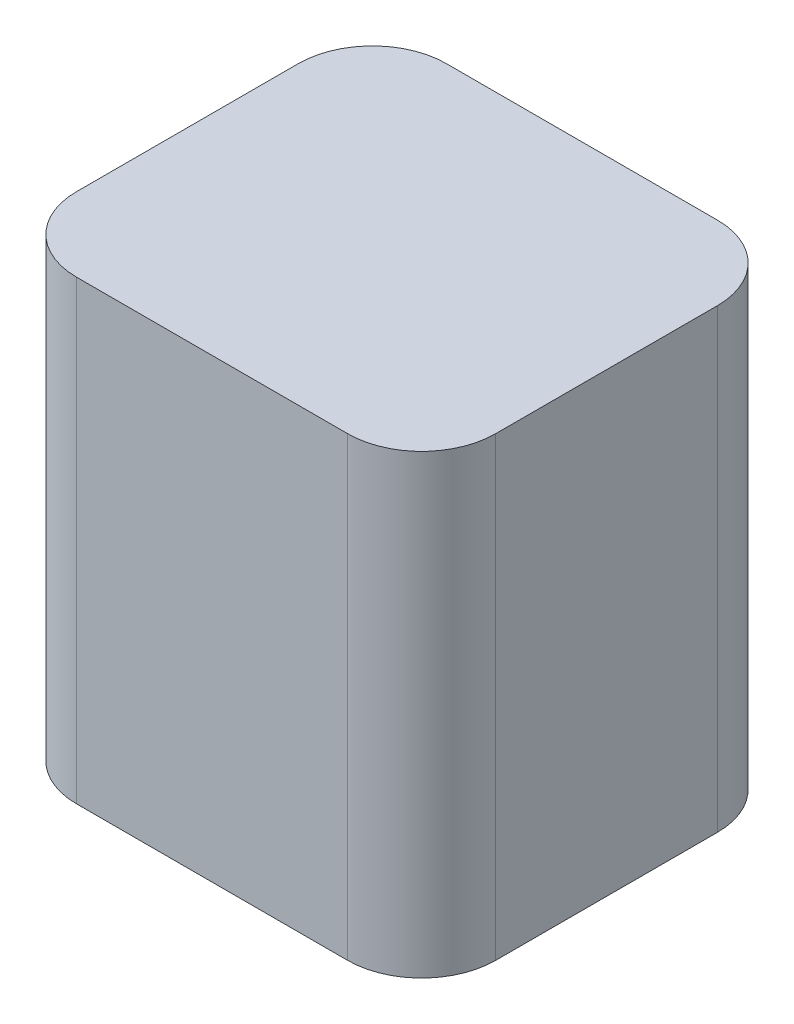
ISO-10303-21;
HEADER;
FILE_DESCRIPTION(('STEP AP214'),'2;1');
FILE_NAME('part.step','',(''),(''),'','','');
FILE_SCHEMA(('AUTOMOTIVE_DESIGN { 1 0 10303 214 1 1 1 1 }'));
ENDSEC;
DATA;
#1=APPLICATION_CONTEXT('core data for automotive mechanical design processes');
#2=APPLICATION_PROTOCOL_DEFINITION('international standard','automotive_design',2000,#1);
#3=PRODUCT_CONTEXT('',#1,'mechanical');
#4=PRODUCT('Part','Part','',(#3));
#5=PRODUCT_RELATED_PRODUCT_CATEGORY('part','',(#4));
#6=PRODUCT_DEFINITION_FORMATION('','',#4);
#7=PRODUCT_DEFINITION_CONTEXT('part definition',#1,'design');
#8=PRODUCT_DEFINITION('design','',#6,#7);
#9=PRODUCT_DEFINITION_SHAPE('','',#8);
#10=(LENGTH_UNIT() NAMED_UNIT(*) SI_UNIT(.MILLI.,.METRE.));
#11=(NAMED_UNIT(*) PLANE_ANGLE_UNIT() SI_UNIT($,.RADIAN.));
#12=(NAMED_UNIT(*) SI_UNIT($,.STERADIAN.) SOLID_ANGLE_UNIT());
#13=UNCERTAINTY_MEASURE_WITH_UNIT(LENGTH_MEASURE(1.E-05),#10,'distance_accuracy_value','');
#14=(GEOMETRIC_REPRESENTATION_CONTEXT(3) GLOBAL_UNCERTAINTY_ASSIGNED_CONTEXT((#13)) GLOBAL_UNIT_ASSIGNED_CONTEXT((#10,
#11,#12)) REPRESENTATION_CONTEXT('',''));
#15=CARTESIAN_POINT('',(0.,0.,0.));
#16=DIRECTION('',(0.,0.,1.));
#17=DIRECTION('',(1.,0.,0.));
#18=AXIS2_PLACEMENT_3D('',#15,#16,#17);
#19=CARTESIAN_POINT('',(431.8,939.8,-381.));
#20=DIRECTION('',(-1.,0.,0.));
#21=DIRECTION('',(0.,0.,1.));
#22=AXIS2_PLACEMENT_3D('',#19,#20,#21);
#23=PLANE('',#22);
#24=DIRECTION('',(0.,0.,-1.));
#25=VECTOR('',#24,1.);
#26=CARTESIAN_POINT('',(431.8,0.,-381.));
#27=LINE('',#26,#25);
#28=CARTESIAN_POINT('',(431.8,0.,228.6));
#29=VERTEX_POINT('',#28);
#30=CARTESIAN_POINT('',(431.8,0.,-228.6));
#31=VERTEX_POINT('',#30);
#32=EDGE_CURVE('E129',#29,#31,#27,.T.);
#33=ORIENTED_EDGE('',*,*,#32,.T.);
#34=DIRECTION('',(0.,-1.,0.));
#35=VECTOR('',#34,1.);
#36=CARTESIAN_POINT('',(431.8,939.8,-228.6));
#37=LINE('',#36,#35);
#38=CARTESIAN_POINT('',(431.8,939.8,-228.6));
#39=VERTEX_POINT('',#38);
#40=EDGE_CURVE('E152',#31,#39,#37,.F.);
#41=ORIENTED_EDGE('',*,*,#40,.T.);
#42=DIRECTION('',(0.,0.,-1.));
#43=VECTOR('',#42,1.);
#44=CARTESIAN_POINT('',(431.8,939.8,-381.));
#45=LINE('',#44,#43);
#46=CARTESIAN_POINT('',(431.8,939.8,228.6));
#47=VERTEX_POINT('',#46);
#48=EDGE_CURVE('E127',#47,#39,#45,.T.);
#49=ORIENTED_EDGE('',*,*,#48,.F.);
#50=DIRECTION('',(0.,-1.,0.));
#51=VECTOR('',#50,1.);
#52=CARTESIAN_POINT('',(431.8,939.8,228.6));
#53=LINE('',#52,#51);
#54=EDGE_CURVE('E149',#47,#29,#53,.T.);
#55=ORIENTED_EDGE('',*,*,#54,.T.);
#56=EDGE_LOOP('',(#33,#41,#49,#55));
#57=FACE_BOUND('',#56,.T.);
#58=ADVANCED_FACE('F34',(#57),#23,.F.);
#59=CARTESIAN_POINT('',(-431.8,939.8,-381.));
#60=DIRECTION('',(0.,0.,1.));
#61=DIRECTION('',(1.,0.,0.));
#62=AXIS2_PLACEMENT_3D('',#59,#60,#61);
#63=PLANE('',#62);
#64=DIRECTION('',(-1.,0.,0.));
#65=VECTOR('',#64,1.);
#66=CARTESIAN_POINT('',(-431.8,0.,-381.));
#67=LINE('',#66,#65);
#68=CARTESIAN_POINT('',(279.4,0.,-381.));
#69=VERTEX_POINT('',#68);
#70=CARTESIAN_POINT('',(-279.4,0.,-381.));
#71=VERTEX_POINT('',#70);
#72=EDGE_CURVE('E125',#69,#71,#67,.T.);
#73=ORIENTED_EDGE('',*,*,#72,.T.);
#74=DIRECTION('',(0.,-1.,0.));
#75=VECTOR('',#74,1.);
#76=CARTESIAN_POINT('',(-279.4,939.8,-381.));
#77=LINE('',#76,#75);
#78=CARTESIAN_POINT('',(-279.4,939.8,-381.));
#79=VERTEX_POINT('',#78);
#80=EDGE_CURVE('E104',#71,#79,#77,.F.);
#81=ORIENTED_EDGE('',*,*,#80,.T.);
#82=DIRECTION('',(-1.,0.,0.));
#83=VECTOR('',#82,1.);
#84=CARTESIAN_POINT('',(-431.8,939.8,-381.));
#85=LINE('',#84,#83);
#86=CARTESIAN_POINT('',(279.4,939.8,-381.));
#87=VERTEX_POINT('',#86);
#88=EDGE_CURVE('E168',#87,#79,#85,.T.);
#89=ORIENTED_EDGE('',*,*,#88,.F.);
#90=DIRECTION('',(0.,-1.,0.));
#91=VECTOR('',#90,1.);
#92=CARTESIAN_POINT('',(279.4,939.8,-381.));
#93=LINE('',#92,#91);
#94=EDGE_CURVE('E109',#87,#69,#93,.T.);
#95=ORIENTED_EDGE('',*,*,#94,.T.);
#96=EDGE_LOOP('',(#73,#81,#89,#95));
#97=FACE_BOUND('',#96,.T.);
#98=ADVANCED_FACE('F185',(#97),#63,.F.);
#99=CARTESIAN_POINT('',(-431.8,939.8,-381.));
#100=DIRECTION('',(1.,0.,0.));
#101=DIRECTION('',(0.,0.,-1.));
#102=AXIS2_PLACEMENT_3D('',#99,#100,#101);
#103=PLANE('',#102);
#104=DIRECTION('',(0.,0.,1.));
#105=VECTOR('',#104,1.);
#106=CARTESIAN_POINT('',(-431.8,939.8,-381.));
#107=LINE('',#106,#105);
#108=CARTESIAN_POINT('',(-431.8,939.8,-228.6));
#109=VERTEX_POINT('',#108);
#110=CARTESIAN_POINT('',(-431.8,939.8,228.6));
#111=VERTEX_POINT('',#110);
#112=EDGE_CURVE('E118',#109,#111,#107,.T.);
#113=ORIENTED_EDGE('',*,*,#112,.F.);
#114=DIRECTION('',(0.,-1.,0.));
#115=VECTOR('',#114,1.);
#116=CARTESIAN_POINT('',(-431.8,939.8,-228.6));
#117=LINE('',#116,#115);
#118=CARTESIAN_POINT('',(-431.8,0.,-228.6));
#119=VERTEX_POINT('',#118);
#120=EDGE_CURVE('E103',#109,#119,#117,.T.);
#121=ORIENTED_EDGE('',*,*,#120,.T.);
#122=DIRECTION('',(0.,0.,1.));
#123=VECTOR('',#122,1.);
#124=CARTESIAN_POINT('',(-431.8,0.,-381.));
#125=LINE('',#124,#123);
#126=CARTESIAN_POINT('',(-431.8,0.,228.6));
#127=VERTEX_POINT('',#126);
#128=EDGE_CURVE('E116',#119,#127,#125,.T.);
#129=ORIENTED_EDGE('',*,*,#128,.T.);
#130=DIRECTION('',(0.,-1.,0.));
#131=VECTOR('',#130,1.);
#132=CARTESIAN_POINT('',(-431.8,939.8,228.6));
#133=LINE('',#132,#131);
#134=EDGE_CURVE('E120',#127,#111,#133,.F.);
#135=ORIENTED_EDGE('',*,*,#134,.T.);
#136=EDGE_LOOP('',(#113,#121,#129,#135));
#137=FACE_BOUND('',#136,.T.);
#138=ADVANCED_FACE('F115',(#137),#103,.F.);
#139=CARTESIAN_POINT('',(-431.8,939.8,381.));
#140=DIRECTION('',(0.,0.,-1.));
#141=DIRECTION('',(-1.,0.,0.));
#142=AXIS2_PLACEMENT_3D('',#139,#140,#141);
#143=PLANE('',#142);
#144=DIRECTION('',(1.,0.,0.));
#145=VECTOR('',#144,1.);
#146=CARTESIAN_POINT('',(-431.8,0.,381.));
#147=LINE('',#146,#145);
#148=CARTESIAN_POINT('',(-279.4,0.,381.));
#149=VERTEX_POINT('',#148);
#150=CARTESIAN_POINT('',(279.4,0.,381.));
#151=VERTEX_POINT('',#150);
#152=EDGE_CURVE('E124',#149,#151,#147,.T.);
#153=ORIENTED_EDGE('',*,*,#152,.T.);
#154=DIRECTION('',(0.,-1.,0.));
#155=VECTOR('',#154,1.);
#156=CARTESIAN_POINT('',(279.4,939.8,381.));
#157=LINE('',#156,#155);
#158=CARTESIAN_POINT('',(279.4,939.8,381.));
#159=VERTEX_POINT('',#158);
#160=EDGE_CURVE('E11',#151,#159,#157,.F.);
#161=ORIENTED_EDGE('',*,*,#160,.T.);
#162=DIRECTION('',(1.,0.,0.));
#163=VECTOR('',#162,1.);
#164=CARTESIAN_POINT('',(-431.8,939.8,381.));
#165=LINE('',#164,#163);
#166=CARTESIAN_POINT('',(-279.4,939.8,381.));
#167=VERTEX_POINT('',#166);
#168=EDGE_CURVE('E133',#167,#159,#165,.T.);
#169=ORIENTED_EDGE('',*,*,#168,.F.);
#170=DIRECTION('',(0.,-1.,0.));
#171=VECTOR('',#170,1.);
#172=CARTESIAN_POINT('',(-279.4,939.8,381.));
#173=LINE('',#172,#171);
#174=EDGE_CURVE('E42',#167,#149,#173,.T.);
#175=ORIENTED_EDGE('',*,*,#174,.T.);
#176=EDGE_LOOP('',(#153,#161,#169,#175));
#177=FACE_BOUND('',#176,.T.);
#178=ADVANCED_FACE('F155',(#177),#143,.F.);
#179=CARTESIAN_POINT('',(0.,939.8,0.));
#180=DIRECTION('',(0.,1.,0.));
#181=DIRECTION('',(0.,0.,1.));
#182=AXIS2_PLACEMENT_3D('',#179,#180,#181);
#183=PLANE('',#182);
#184=ORIENTED_EDGE('',*,*,#88,.T.);
#185=CARTESIAN_POINT('',(-279.4,939.8,-228.6));
#186=DIRECTION('',(0.,1.,0.));
#187=DIRECTION('',(0.,0.,1.));
#188=AXIS2_PLACEMENT_3D('',#185,#186,#187);
#189=CIRCLE('',#188,152.4);
#190=EDGE_CURVE('E147',#79,#109,#189,.T.);
#191=ORIENTED_EDGE('',*,*,#190,.T.);
#192=ORIENTED_EDGE('',*,*,#112,.T.);
#193=CARTESIAN_POINT('',(-279.4,939.8,228.6));
#194=DIRECTION('',(0.,1.,0.));
#195=DIRECTION('',(0.,0.,1.));
#196=AXIS2_PLACEMENT_3D('',#193,#194,#195);
#197=CIRCLE('',#196,152.4);
#198=EDGE_CURVE('E54',#111,#167,#197,.T.);
#199=ORIENTED_EDGE('',*,*,#198,.T.);
#200=ORIENTED_EDGE('',*,*,#168,.T.);
#201=CARTESIAN_POINT('',(279.4,939.8,228.6));
#202=DIRECTION('',(0.,1.,0.));
#203=DIRECTION('',(0.,0.,1.));
#204=AXIS2_PLACEMENT_3D('',#201,#202,#203);
#205=CIRCLE('',#204,152.4);
#206=EDGE_CURVE('E143',#159,#47,#205,.T.);
#207=ORIENTED_EDGE('',*,*,#206,.T.);
#208=ORIENTED_EDGE('',*,*,#48,.T.);
#209=CARTESIAN_POINT('',(279.4,939.8,-228.6));
#210=DIRECTION('',(0.,1.,0.));
#211=DIRECTION('',(0.,0.,1.));
#212=AXIS2_PLACEMENT_3D('',#209,#210,#211);
#213=CIRCLE('',#212,152.4);
#214=EDGE_CURVE('E145',#39,#87,#213,.T.);
#215=ORIENTED_EDGE('',*,*,#214,.T.);
#216=EDGE_LOOP('',(#184,#191,#192,#199,#200,#207,#208,#215));
#217=FACE_BOUND('',#216,.T.);
#218=ADVANCED_FACE('F174',(#217),#183,.T.);
#219=CARTESIAN_POINT('',(0.,0.,0.));
#220=DIRECTION('',(0.,1.,0.));
#221=DIRECTION('',(0.,0.,1.));
#222=AXIS2_PLACEMENT_3D('',#219,#220,#221);
#223=PLANE('',#222);
#224=ORIENTED_EDGE('',*,*,#128,.F.);
#225=CARTESIAN_POINT('',(-279.4,0.,-228.6));
#226=DIRECTION('',(0.,1.,0.));
#227=DIRECTION('',(0.,0.,1.));
#228=AXIS2_PLACEMENT_3D('',#225,#226,#227);
#229=CIRCLE('',#228,152.4);
#230=EDGE_CURVE('E99',#119,#71,#229,.F.);
#231=ORIENTED_EDGE('',*,*,#230,.T.);
#232=ORIENTED_EDGE('',*,*,#72,.F.);
#233=CARTESIAN_POINT('',(279.4,0.,-228.6));
#234=DIRECTION('',(0.,1.,0.));
#235=DIRECTION('',(0.,0.,1.));
#236=AXIS2_PLACEMENT_3D('',#233,#234,#235);
#237=CIRCLE('',#236,152.4);
#238=EDGE_CURVE('E110',#69,#31,#237,.F.);
#239=ORIENTED_EDGE('',*,*,#238,.T.);
#240=ORIENTED_EDGE('',*,*,#32,.F.);
#241=CARTESIAN_POINT('',(279.4,0.,228.6));
#242=DIRECTION('',(0.,1.,0.));
#243=DIRECTION('',(0.,0.,1.));
#244=AXIS2_PLACEMENT_3D('',#241,#242,#243);
#245=CIRCLE('',#244,152.4);
#246=EDGE_CURVE('E136',#29,#151,#245,.F.);
#247=ORIENTED_EDGE('',*,*,#246,.T.);
#248=ORIENTED_EDGE('',*,*,#152,.F.);
#249=CARTESIAN_POINT('',(-279.4,0.,228.6));
#250=DIRECTION('',(0.,1.,0.));
#251=DIRECTION('',(0.,0.,1.));
#252=AXIS2_PLACEMENT_3D('',#249,#250,#251);
#253=CIRCLE('',#252,152.4);
#254=EDGE_CURVE('E119',#149,#127,#253,.F.);
#255=ORIENTED_EDGE('',*,*,#254,.T.);
#256=EDGE_LOOP('',(#224,#231,#232,#239,#240,#247,#248,#255));
#257=FACE_BOUND('',#256,.T.);
#258=ADVANCED_FACE('F122',(#257),#223,.F.);
#259=CARTESIAN_POINT('',(-279.4,939.8,-228.6));
#260=DIRECTION('',(0.,-1.,0.));
#261=DIRECTION('',(0.,0.,-1.));
#262=AXIS2_PLACEMENT_3D('',#259,#260,#261);
#263=CYLINDRICAL_SURFACE('',#262,152.4);
#264=ORIENTED_EDGE('',*,*,#190,.F.);
#265=ORIENTED_EDGE('',*,*,#80,.F.);
#266=ORIENTED_EDGE('',*,*,#230,.F.);
#267=ORIENTED_EDGE('',*,*,#120,.F.);
#268=EDGE_LOOP('',(#264,#265,#266,#267));
#269=FACE_BOUND('',#268,.T.);
#270=ADVANCED_FACE('F102',(#269),#263,.T.);
#271=CARTESIAN_POINT('',(279.4,939.8,-228.6));
#272=DIRECTION('',(0.,-1.,0.));
#273=DIRECTION('',(0.,0.,-1.));
#274=AXIS2_PLACEMENT_3D('',#271,#272,#273);
#275=CYLINDRICAL_SURFACE('',#274,152.4);
#276=ORIENTED_EDGE('',*,*,#214,.F.);
#277=ORIENTED_EDGE('',*,*,#40,.F.);
#278=ORIENTED_EDGE('',*,*,#238,.F.);
#279=ORIENTED_EDGE('',*,*,#94,.F.);
#280=EDGE_LOOP('',(#276,#277,#278,#279));
#281=FACE_BOUND('',#280,.T.);
#282=ADVANCED_FACE('F196',(#281),#275,.T.);
#283=CARTESIAN_POINT('',(279.4,939.8,228.6));
#284=DIRECTION('',(0.,-1.,0.));
#285=DIRECTION('',(0.,0.,-1.));
#286=AXIS2_PLACEMENT_3D('',#283,#284,#285);
#287=CYLINDRICAL_SURFACE('',#286,152.4);
#288=ORIENTED_EDGE('',*,*,#206,.F.);
#289=ORIENTED_EDGE('',*,*,#160,.F.);
#290=ORIENTED_EDGE('',*,*,#246,.F.);
#291=ORIENTED_EDGE('',*,*,#54,.F.);
#292=EDGE_LOOP('',(#288,#289,#290,#291));
#293=FACE_BOUND('',#292,.T.);
#294=ADVANCED_FACE('F162',(#293),#287,.T.);
#295=CARTESIAN_POINT('',(-279.4,939.8,228.6));
#296=DIRECTION('',(0.,-1.,0.));
#297=DIRECTION('',(0.,0.,-1.));
#298=AXIS2_PLACEMENT_3D('',#295,#296,#297);
#299=CYLINDRICAL_SURFACE('',#298,152.4);
#300=ORIENTED_EDGE('',*,*,#198,.F.);
#301=ORIENTED_EDGE('',*,*,#134,.F.);
#302=ORIENTED_EDGE('',*,*,#254,.F.);
#303=ORIENTED_EDGE('',*,*,#174,.F.);
#304=EDGE_LOOP('',(#300,#301,#302,#303));
#305=FACE_BOUND('',#304,.T.);
#306=ADVANCED_FACE('F36',(#305),#299,.T.);
#307=CLOSED_SHELL('',(#58,#98,#138,#178,#218,#258,#270,#282,#294,#306));
#308=MANIFOLD_SOLID_BREP('B2',#307);
#309=ADVANCED_BREP_SHAPE_REPRESENTATION('',(#18,#308),#14);
#310=SHAPE_DEFINITION_REPRESENTATION(#9,#309);
ENDSEC;
END-ISO-10303-21;
